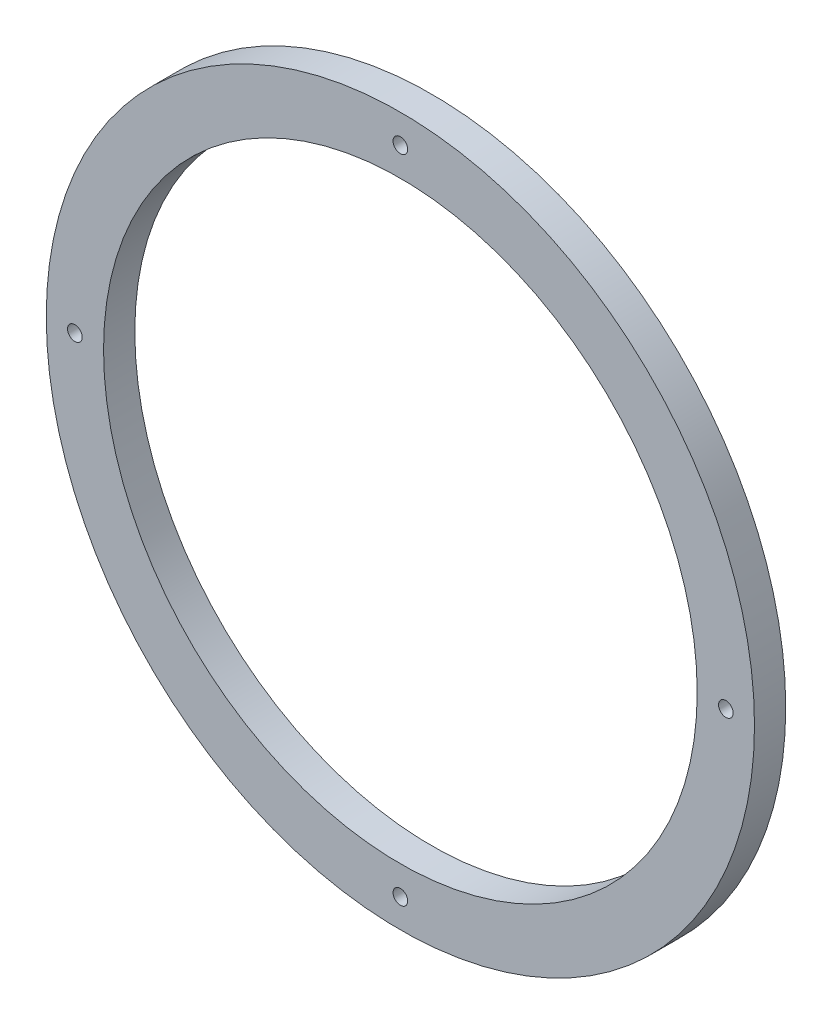
ISO-10303-21;
HEADER;
FILE_DESCRIPTION(('STEP AP214'),'2;1');
FILE_NAME('part.step','',(''),(''),'','','');
FILE_SCHEMA(('AUTOMOTIVE_DESIGN { 1 0 10303 214 1 1 1 1 }'));
ENDSEC;
DATA;
#1=APPLICATION_CONTEXT('core data for automotive mechanical design processes');
#2=APPLICATION_PROTOCOL_DEFINITION('international standard','automotive_design',2000,#1);
#3=PRODUCT_CONTEXT('',#1,'mechanical');
#4=PRODUCT('Part','Part','',(#3));
#5=PRODUCT_RELATED_PRODUCT_CATEGORY('part','',(#4));
#6=PRODUCT_DEFINITION_FORMATION('','',#4);
#7=PRODUCT_DEFINITION_CONTEXT('part definition',#1,'design');
#8=PRODUCT_DEFINITION('design','',#6,#7);
#9=PRODUCT_DEFINITION_SHAPE('','',#8);
#10=(LENGTH_UNIT() NAMED_UNIT(*) SI_UNIT(.MILLI.,.METRE.));
#11=(NAMED_UNIT(*) PLANE_ANGLE_UNIT() SI_UNIT($,.RADIAN.));
#12=(NAMED_UNIT(*) SI_UNIT($,.STERADIAN.) SOLID_ANGLE_UNIT());
#13=UNCERTAINTY_MEASURE_WITH_UNIT(LENGTH_MEASURE(1.E-05),#10,'distance_accuracy_value','');
#14=(GEOMETRIC_REPRESENTATION_CONTEXT(3) GLOBAL_UNCERTAINTY_ASSIGNED_CONTEXT((#13)) GLOBAL_UNIT_ASSIGNED_CONTEXT((#10,
#11,#12)) REPRESENTATION_CONTEXT('',''));
#15=CARTESIAN_POINT('',(0.,0.,0.));
#16=DIRECTION('',(0.,0.,1.));
#17=DIRECTION('',(1.,0.,0.));
#18=AXIS2_PLACEMENT_3D('',#15,#16,#17);
#19=CARTESIAN_POINT('',(0.,0.,7.62));
#20=DIRECTION('',(0.,0.,1.));
#21=DIRECTION('',(1.,0.,0.));
#22=AXIS2_PLACEMENT_3D('',#19,#20,#21);
#23=PLANE('',#22);
#24=CARTESIAN_POINT('',(2.28331861052244E-12,-79.3749999999977,7.62));
#25=DIRECTION('',(0.,0.,1.));
#26=DIRECTION('',(1.,0.,0.));
#27=AXIS2_PLACEMENT_3D('',#24,#25,#26);
#28=CIRCLE('',#27,1.78593750000338);
#29=CARTESIAN_POINT('',(-1.7859375000011,-79.3749999999977,7.62));
#30=VERTEX_POINT('',#29);
#31=EDGE_CURVE('E60',#30,#30,#28,.T.);
#32=ORIENTED_EDGE('',*,*,#31,.F.);
#33=EDGE_LOOP('',(#32));
#34=FACE_BOUND('',#33,.T.);
#35=CARTESIAN_POINT('',(0.,79.375,7.62));
#36=DIRECTION('',(0.,0.,1.));
#37=DIRECTION('',(1.,0.,0.));
#38=AXIS2_PLACEMENT_3D('',#35,#36,#37);
#39=CIRCLE('',#38,1.7859375);
#40=CARTESIAN_POINT('',(-1.7859375,79.375,7.62));
#41=VERTEX_POINT('',#40);
#42=EDGE_CURVE('E48',#41,#41,#39,.T.);
#43=ORIENTED_EDGE('',*,*,#42,.F.);
#44=EDGE_LOOP('',(#43));
#45=FACE_BOUND('',#44,.T.);
#46=CARTESIAN_POINT('',(0.,0.,7.62));
#47=DIRECTION('',(0.,0.,1.));
#48=DIRECTION('',(1.,0.,0.));
#49=AXIS2_PLACEMENT_3D('',#46,#47,#48);
#50=CIRCLE('',#49,86.36);
#51=CARTESIAN_POINT('',(-86.36,0.,7.62));
#52=VERTEX_POINT('',#51);
#53=EDGE_CURVE('E10',#52,#52,#50,.T.);
#54=ORIENTED_EDGE('',*,*,#53,.T.);
#55=EDGE_LOOP('',(#54));
#56=FACE_BOUND('',#55,.T.);
#57=CARTESIAN_POINT('',(0.,0.,7.62));
#58=DIRECTION('',(0.,0.,1.));
#59=DIRECTION('',(1.,0.,0.));
#60=AXIS2_PLACEMENT_3D('',#57,#58,#59);
#61=CIRCLE('',#60,72.39);
#62=CARTESIAN_POINT('',(-72.39,0.,7.62));
#63=VERTEX_POINT('',#62);
#64=EDGE_CURVE('E43',#63,#63,#61,.T.);
#65=ORIENTED_EDGE('',*,*,#64,.F.);
#66=EDGE_LOOP('',(#65));
#67=FACE_BOUND('',#66,.T.);
#68=CARTESIAN_POINT('',(79.375,2.27595720048157E-12,7.62));
#69=DIRECTION('',(0.,0.,1.));
#70=DIRECTION('',(1.,0.,0.));
#71=AXIS2_PLACEMENT_3D('',#68,#69,#70);
#72=CIRCLE('',#71,1.78593750000244);
#73=CARTESIAN_POINT('',(77.5890624999976,2.27595720048157E-12,7.62));
#74=VERTEX_POINT('',#73);
#75=EDGE_CURVE('E54',#74,#74,#72,.T.);
#76=ORIENTED_EDGE('',*,*,#75,.F.);
#77=EDGE_LOOP('',(#76));
#78=FACE_BOUND('',#77,.T.);
#79=CARTESIAN_POINT('',(-79.3749999999978,0.,7.62));
#80=DIRECTION('',(0.,0.,1.));
#81=DIRECTION('',(1.,0.,0.));
#82=AXIS2_PLACEMENT_3D('',#79,#80,#81);
#83=CIRCLE('',#82,1.78593750000146);
#84=CARTESIAN_POINT('',(-81.1609374999992,0.,7.62));
#85=VERTEX_POINT('',#84);
#86=EDGE_CURVE('E66',#85,#85,#83,.T.);
#87=ORIENTED_EDGE('',*,*,#86,.F.);
#88=EDGE_LOOP('',(#87));
#89=FACE_BOUND('',#88,.T.);
#90=ADVANCED_FACE('F32',(#34,#45,#56,#67,#78,#89),#23,.T.);
#91=CARTESIAN_POINT('',(0.,0.,0.));
#92=DIRECTION('',(0.,0.,1.));
#93=DIRECTION('',(1.,0.,0.));
#94=AXIS2_PLACEMENT_3D('',#91,#92,#93);
#95=PLANE('',#94);
#96=CARTESIAN_POINT('',(0.,0.,0.));
#97=DIRECTION('',(0.,0.,1.));
#98=DIRECTION('',(1.,0.,0.));
#99=AXIS2_PLACEMENT_3D('',#96,#97,#98);
#100=CIRCLE('',#99,86.36);
#101=CARTESIAN_POINT('',(-86.36,0.,0.));
#102=VERTEX_POINT('',#101);
#103=EDGE_CURVE('E36',#102,#102,#100,.T.);
#104=ORIENTED_EDGE('',*,*,#103,.F.);
#105=EDGE_LOOP('',(#104));
#106=FACE_BOUND('',#105,.T.);
#107=CARTESIAN_POINT('',(0.,0.,0.));
#108=DIRECTION('',(0.,0.,1.));
#109=DIRECTION('',(1.,0.,0.));
#110=AXIS2_PLACEMENT_3D('',#107,#108,#109);
#111=CIRCLE('',#110,72.39);
#112=CARTESIAN_POINT('',(-72.39,0.,0.));
#113=VERTEX_POINT('',#112);
#114=EDGE_CURVE('E45',#113,#113,#111,.T.);
#115=ORIENTED_EDGE('',*,*,#114,.T.);
#116=EDGE_LOOP('',(#115));
#117=FACE_BOUND('',#116,.T.);
#118=CARTESIAN_POINT('',(0.,79.375,0.));
#119=DIRECTION('',(0.,0.,1.));
#120=DIRECTION('',(1.,0.,0.));
#121=AXIS2_PLACEMENT_3D('',#118,#119,#120);
#122=CIRCLE('',#121,1.7859375);
#123=CARTESIAN_POINT('',(-1.7859375,79.375,0.));
#124=VERTEX_POINT('',#123);
#125=EDGE_CURVE('E51',#124,#124,#122,.T.);
#126=ORIENTED_EDGE('',*,*,#125,.T.);
#127=EDGE_LOOP('',(#126));
#128=FACE_BOUND('',#127,.T.);
#129=CARTESIAN_POINT('',(79.375,2.27595720048157E-12,0.));
#130=DIRECTION('',(0.,0.,1.));
#131=DIRECTION('',(1.,0.,0.));
#132=AXIS2_PLACEMENT_3D('',#129,#130,#131);
#133=CIRCLE('',#132,1.78593750000244);
#134=CARTESIAN_POINT('',(77.5890624999976,2.27595720048157E-12,0.));
#135=VERTEX_POINT('',#134);
#136=EDGE_CURVE('E57',#135,#135,#133,.T.);
#137=ORIENTED_EDGE('',*,*,#136,.T.);
#138=EDGE_LOOP('',(#137));
#139=FACE_BOUND('',#138,.T.);
#140=CARTESIAN_POINT('',(2.28331861052244E-12,-79.3749999999977,0.));
#141=DIRECTION('',(0.,0.,1.));
#142=DIRECTION('',(1.,0.,0.));
#143=AXIS2_PLACEMENT_3D('',#140,#141,#142);
#144=CIRCLE('',#143,1.78593750000338);
#145=CARTESIAN_POINT('',(-1.7859375000011,-79.3749999999977,0.));
#146=VERTEX_POINT('',#145);
#147=EDGE_CURVE('E63',#146,#146,#144,.T.);
#148=ORIENTED_EDGE('',*,*,#147,.T.);
#149=EDGE_LOOP('',(#148));
#150=FACE_BOUND('',#149,.T.);
#151=CARTESIAN_POINT('',(-79.3749999999978,0.,0.));
#152=DIRECTION('',(0.,0.,1.));
#153=DIRECTION('',(1.,0.,0.));
#154=AXIS2_PLACEMENT_3D('',#151,#152,#153);
#155=CIRCLE('',#154,1.78593750000146);
#156=CARTESIAN_POINT('',(-81.1609374999992,0.,0.));
#157=VERTEX_POINT('',#156);
#158=EDGE_CURVE('E69',#157,#157,#155,.T.);
#159=ORIENTED_EDGE('',*,*,#158,.T.);
#160=EDGE_LOOP('',(#159));
#161=FACE_BOUND('',#160,.T.);
#162=ADVANCED_FACE('F79',(#106,#117,#128,#139,#150,#161),#95,.F.);
#163=CARTESIAN_POINT('',(0.,0.,7.62));
#164=DIRECTION('',(0.,0.,-1.));
#165=DIRECTION('',(-1.,0.,0.));
#166=AXIS2_PLACEMENT_3D('',#163,#164,#165);
#167=CYLINDRICAL_SURFACE('',#166,86.36);
#168=CARTESIAN_POINT('',(-86.36,0.,7.62));
#169=CARTESIAN_POINT('',(-86.36,0.,7.540625));
#170=CARTESIAN_POINT('',(-86.36,0.,7.46125));
#171=CARTESIAN_POINT('',(-86.36,0.,7.3025));
#172=CARTESIAN_POINT('',(-86.36,0.,7.223125));
#173=CARTESIAN_POINT('',(-86.36,0.,7.064375));
#174=CARTESIAN_POINT('',(-86.36,0.,6.985));
#175=CARTESIAN_POINT('',(-86.36,0.,6.82625));
#176=CARTESIAN_POINT('',(-86.36,0.,6.746875));
#177=CARTESIAN_POINT('',(-86.36,0.,6.588125));
#178=CARTESIAN_POINT('',(-86.36,0.,6.50875));
#179=CARTESIAN_POINT('',(-86.36,0.,6.35));
#180=CARTESIAN_POINT('',(-86.36,0.,6.270625));
#181=CARTESIAN_POINT('',(-86.36,0.,6.111875));
#182=CARTESIAN_POINT('',(-86.36,0.,6.0325));
#183=CARTESIAN_POINT('',(-86.36,0.,5.87375));
#184=CARTESIAN_POINT('',(-86.36,0.,5.794375));
#185=CARTESIAN_POINT('',(-86.36,0.,5.635625));
#186=CARTESIAN_POINT('',(-86.36,0.,5.55625));
#187=CARTESIAN_POINT('',(-86.36,0.,5.3975));
#188=CARTESIAN_POINT('',(-86.36,0.,5.318125));
#189=CARTESIAN_POINT('',(-86.36,0.,5.159375));
#190=CARTESIAN_POINT('',(-86.36,0.,5.08));
#191=CARTESIAN_POINT('',(-86.36,0.,4.92125));
#192=CARTESIAN_POINT('',(-86.36,0.,4.841875));
#193=CARTESIAN_POINT('',(-86.36,0.,4.683125));
#194=CARTESIAN_POINT('',(-86.36,0.,4.60375));
#195=CARTESIAN_POINT('',(-86.36,0.,4.445));
#196=CARTESIAN_POINT('',(-86.36,0.,4.365625));
#197=CARTESIAN_POINT('',(-86.36,0.,4.206875));
#198=CARTESIAN_POINT('',(-86.36,0.,4.1275));
#199=CARTESIAN_POINT('',(-86.36,0.,3.96875));
#200=CARTESIAN_POINT('',(-86.36,0.,3.889375));
#201=CARTESIAN_POINT('',(-86.36,0.,3.730625));
#202=CARTESIAN_POINT('',(-86.36,0.,3.65125));
#203=CARTESIAN_POINT('',(-86.36,0.,3.4925));
#204=CARTESIAN_POINT('',(-86.36,0.,3.413125));
#205=CARTESIAN_POINT('',(-86.36,0.,3.254375));
#206=CARTESIAN_POINT('',(-86.36,0.,3.175));
#207=CARTESIAN_POINT('',(-86.36,0.,3.01625));
#208=CARTESIAN_POINT('',(-86.36,0.,2.936875));
#209=CARTESIAN_POINT('',(-86.36,0.,2.778125));
#210=CARTESIAN_POINT('',(-86.36,0.,2.69875));
#211=CARTESIAN_POINT('',(-86.36,0.,2.54));
#212=CARTESIAN_POINT('',(-86.36,0.,2.460625));
#213=CARTESIAN_POINT('',(-86.36,0.,2.301875));
#214=CARTESIAN_POINT('',(-86.36,0.,2.2225));
#215=CARTESIAN_POINT('',(-86.36,0.,2.06375));
#216=CARTESIAN_POINT('',(-86.36,0.,1.984375));
#217=CARTESIAN_POINT('',(-86.36,0.,1.825625));
#218=CARTESIAN_POINT('',(-86.36,0.,1.74625));
#219=CARTESIAN_POINT('',(-86.36,0.,1.5875));
#220=CARTESIAN_POINT('',(-86.36,0.,1.508125));
#221=CARTESIAN_POINT('',(-86.36,0.,1.349375));
#222=CARTESIAN_POINT('',(-86.36,0.,1.27));
#223=CARTESIAN_POINT('',(-86.36,0.,1.11125));
#224=CARTESIAN_POINT('',(-86.36,0.,1.031875));
#225=CARTESIAN_POINT('',(-86.36,0.,0.873125));
#226=CARTESIAN_POINT('',(-86.36,0.,0.79375));
#227=CARTESIAN_POINT('',(-86.36,0.,0.635));
#228=CARTESIAN_POINT('',(-86.36,0.,0.555625));
#229=CARTESIAN_POINT('',(-86.36,0.,0.396875));
#230=CARTESIAN_POINT('',(-86.36,0.,0.3175));
#231=CARTESIAN_POINT('',(-86.36,0.,0.15875));
#232=CARTESIAN_POINT('',(-86.36,0.,0.0793749999999999));
#233=CARTESIAN_POINT('',(-86.36,0.,0.));
#234=B_SPLINE_CURVE_WITH_KNOTS('',3,(#168,#169,#170,#171,#172,#173,#174,#175,#176,#177,#178,
#179,#180,#181,#182,#183,#184,#185,#186,#187,#188,#189,#190,#191,#192,#193,#194,#195,#196,#197,
#198,#199,#200,#201,#202,#203,#204,#205,#206,#207,#208,#209,#210,#211,#212,#213,#214,#215,#216,
#217,#218,#219,#220,#221,#222,#223,#224,#225,#226,#227,#228,#229,#230,#231,#232,#233),
.UNSPECIFIED.,.F.,.F.,(4,2,2,2,2,2,2,2,2,2,2,2,2,2,2,2,2,2,2,2,2,2,2,2,2,2,2,2,2,2,2,2,4),(0.,
0.238125,0.476249999999999,0.714375,0.952499999999999,1.190625,1.42875,1.666875,1.905,2.143125,
2.38125,2.619375,2.8575,3.095625,3.33375,3.571875,3.81,4.048125,4.28625,4.524375,4.7625,
5.000625,5.23875,5.476875,5.715,5.953125,6.19125,6.429375,6.6675,6.905625,7.14375,7.381875,
7.62),.UNSPECIFIED.);
#235=EDGE_CURVE('BSEAM34',#52,#102,#234,.T.);
#236=ORIENTED_EDGE('',*,*,#53,.F.);
#237=ORIENTED_EDGE('',*,*,#103,.T.);
#238=ORIENTED_EDGE('',*,*,#235,.T.);
#239=ORIENTED_EDGE('',*,*,#235,.F.);
#240=EDGE_LOOP('',(#236,#238,#237,#239));
#241=FACE_BOUND('',#240,.T.);
#242=ADVANCED_FACE('F34',(#241),#167,.T.);
#243=CARTESIAN_POINT('',(0.,0.,7.62));
#244=DIRECTION('',(0.,0.,-1.));
#245=DIRECTION('',(-1.,0.,0.));
#246=AXIS2_PLACEMENT_3D('',#243,#244,#245);
#247=CYLINDRICAL_SURFACE('',#246,72.39);
#248=CARTESIAN_POINT('',(-72.39,0.,7.62));
#249=CARTESIAN_POINT('',(-72.39,0.,7.540625));
#250=CARTESIAN_POINT('',(-72.39,0.,7.46125));
#251=CARTESIAN_POINT('',(-72.39,0.,7.3025));
#252=CARTESIAN_POINT('',(-72.39,0.,7.223125));
#253=CARTESIAN_POINT('',(-72.39,0.,7.064375));
#254=CARTESIAN_POINT('',(-72.39,0.,6.985));
#255=CARTESIAN_POINT('',(-72.39,0.,6.82625));
#256=CARTESIAN_POINT('',(-72.39,0.,6.746875));
#257=CARTESIAN_POINT('',(-72.39,0.,6.588125));
#258=CARTESIAN_POINT('',(-72.39,0.,6.50875));
#259=CARTESIAN_POINT('',(-72.39,0.,6.35));
#260=CARTESIAN_POINT('',(-72.39,0.,6.270625));
#261=CARTESIAN_POINT('',(-72.39,0.,6.111875));
#262=CARTESIAN_POINT('',(-72.39,0.,6.0325));
#263=CARTESIAN_POINT('',(-72.39,0.,5.87375));
#264=CARTESIAN_POINT('',(-72.39,0.,5.794375));
#265=CARTESIAN_POINT('',(-72.39,0.,5.635625));
#266=CARTESIAN_POINT('',(-72.39,0.,5.55625));
#267=CARTESIAN_POINT('',(-72.39,0.,5.3975));
#268=CARTESIAN_POINT('',(-72.39,0.,5.318125));
#269=CARTESIAN_POINT('',(-72.39,0.,5.159375));
#270=CARTESIAN_POINT('',(-72.39,0.,5.08));
#271=CARTESIAN_POINT('',(-72.39,0.,4.92125));
#272=CARTESIAN_POINT('',(-72.39,0.,4.841875));
#273=CARTESIAN_POINT('',(-72.39,0.,4.683125));
#274=CARTESIAN_POINT('',(-72.39,0.,4.60375));
#275=CARTESIAN_POINT('',(-72.39,0.,4.445));
#276=CARTESIAN_POINT('',(-72.39,0.,4.365625));
#277=CARTESIAN_POINT('',(-72.39,0.,4.206875));
#278=CARTESIAN_POINT('',(-72.39,0.,4.1275));
#279=CARTESIAN_POINT('',(-72.39,0.,3.96875));
#280=CARTESIAN_POINT('',(-72.39,0.,3.889375));
#281=CARTESIAN_POINT('',(-72.39,0.,3.730625));
#282=CARTESIAN_POINT('',(-72.39,0.,3.65125));
#283=CARTESIAN_POINT('',(-72.39,0.,3.4925));
#284=CARTESIAN_POINT('',(-72.39,0.,3.413125));
#285=CARTESIAN_POINT('',(-72.39,0.,3.254375));
#286=CARTESIAN_POINT('',(-72.39,0.,3.175));
#287=CARTESIAN_POINT('',(-72.39,0.,3.01625));
#288=CARTESIAN_POINT('',(-72.39,0.,2.936875));
#289=CARTESIAN_POINT('',(-72.39,0.,2.778125));
#290=CARTESIAN_POINT('',(-72.39,0.,2.69875));
#291=CARTESIAN_POINT('',(-72.39,0.,2.54));
#292=CARTESIAN_POINT('',(-72.39,0.,2.460625));
#293=CARTESIAN_POINT('',(-72.39,0.,2.301875));
#294=CARTESIAN_POINT('',(-72.39,0.,2.2225));
#295=CARTESIAN_POINT('',(-72.39,0.,2.06375));
#296=CARTESIAN_POINT('',(-72.39,0.,1.984375));
#297=CARTESIAN_POINT('',(-72.39,0.,1.825625));
#298=CARTESIAN_POINT('',(-72.39,0.,1.74625));
#299=CARTESIAN_POINT('',(-72.39,0.,1.5875));
#300=CARTESIAN_POINT('',(-72.39,0.,1.508125));
#301=CARTESIAN_POINT('',(-72.39,0.,1.349375));
#302=CARTESIAN_POINT('',(-72.39,0.,1.27));
#303=CARTESIAN_POINT('',(-72.39,0.,1.11125));
#304=CARTESIAN_POINT('',(-72.39,0.,1.031875));
#305=CARTESIAN_POINT('',(-72.39,0.,0.873125));
#306=CARTESIAN_POINT('',(-72.39,0.,0.79375));
#307=CARTESIAN_POINT('',(-72.39,0.,0.635));
#308=CARTESIAN_POINT('',(-72.39,0.,0.555625));
#309=CARTESIAN_POINT('',(-72.39,0.,0.396875));
#310=CARTESIAN_POINT('',(-72.39,0.,0.3175));
#311=CARTESIAN_POINT('',(-72.39,0.,0.15875));
#312=CARTESIAN_POINT('',(-72.39,0.,0.0793749999999999));
#313=CARTESIAN_POINT('',(-72.39,0.,0.));
#314=B_SPLINE_CURVE_WITH_KNOTS('',3,(#248,#249,#250,#251,#252,#253,#254,#255,#256,#257,#258,
#259,#260,#261,#262,#263,#264,#265,#266,#267,#268,#269,#270,#271,#272,#273,#274,#275,#276,#277,
#278,#279,#280,#281,#282,#283,#284,#285,#286,#287,#288,#289,#290,#291,#292,#293,#294,#295,#296,
#297,#298,#299,#300,#301,#302,#303,#304,#305,#306,#307,#308,#309,#310,#311,#312,#313),
.UNSPECIFIED.,.F.,.F.,(4,2,2,2,2,2,2,2,2,2,2,2,2,2,2,2,2,2,2,2,2,2,2,2,2,2,2,2,2,2,2,2,4),(0.,
0.238125,0.476249999999999,0.714375,0.952499999999999,1.190625,1.42875,1.666875,1.905,2.143125,
2.38125,2.619375,2.8575,3.095625,3.33375,3.571875,3.81,4.048125,4.28625,4.524375,4.7625,
5.000625,5.23875,5.476875,5.715,5.953125,6.19125,6.429375,6.6675,6.905625,7.14375,7.381875,
7.62),.UNSPECIFIED.);
#315=EDGE_CURVE('BSEAM89',#63,#113,#314,.T.);
#316=ORIENTED_EDGE('',*,*,#64,.T.);
#317=ORIENTED_EDGE('',*,*,#114,.F.);
#318=ORIENTED_EDGE('',*,*,#315,.T.);
#319=ORIENTED_EDGE('',*,*,#315,.F.);
#320=EDGE_LOOP('',(#316,#318,#317,#319));
#321=FACE_BOUND('',#320,.T.);
#322=ADVANCED_FACE('F89',(#321),#247,.F.);
#323=CARTESIAN_POINT('',(0.,79.375,7.62));
#324=DIRECTION('',(0.,0.,-1.));
#325=DIRECTION('',(-1.,0.,0.));
#326=AXIS2_PLACEMENT_3D('',#323,#324,#325);
#327=CYLINDRICAL_SURFACE('',#326,1.7859375);
#328=CARTESIAN_POINT('',(-1.7859375,79.375,7.62));
#329=CARTESIAN_POINT('',(-1.7859375,79.375,7.540625));
#330=CARTESIAN_POINT('',(-1.7859375,79.375,7.46125));
#331=CARTESIAN_POINT('',(-1.7859375,79.375,7.3025));
#332=CARTESIAN_POINT('',(-1.7859375,79.375,7.223125));
#333=CARTESIAN_POINT('',(-1.7859375,79.375,7.064375));
#334=CARTESIAN_POINT('',(-1.7859375,79.375,6.985));
#335=CARTESIAN_POINT('',(-1.7859375,79.375,6.82625));
#336=CARTESIAN_POINT('',(-1.7859375,79.375,6.746875));
#337=CARTESIAN_POINT('',(-1.7859375,79.375,6.588125));
#338=CARTESIAN_POINT('',(-1.7859375,79.375,6.50875));
#339=CARTESIAN_POINT('',(-1.7859375,79.375,6.35));
#340=CARTESIAN_POINT('',(-1.7859375,79.375,6.270625));
#341=CARTESIAN_POINT('',(-1.7859375,79.375,6.111875));
#342=CARTESIAN_POINT('',(-1.7859375,79.375,6.0325));
#343=CARTESIAN_POINT('',(-1.7859375,79.375,5.87375));
#344=CARTESIAN_POINT('',(-1.7859375,79.375,5.794375));
#345=CARTESIAN_POINT('',(-1.7859375,79.375,5.635625));
#346=CARTESIAN_POINT('',(-1.7859375,79.375,5.55625));
#347=CARTESIAN_POINT('',(-1.7859375,79.375,5.3975));
#348=CARTESIAN_POINT('',(-1.7859375,79.375,5.318125));
#349=CARTESIAN_POINT('',(-1.7859375,79.375,5.159375));
#350=CARTESIAN_POINT('',(-1.7859375,79.375,5.08));
#351=CARTESIAN_POINT('',(-1.7859375,79.375,4.92125));
#352=CARTESIAN_POINT('',(-1.7859375,79.375,4.841875));
#353=CARTESIAN_POINT('',(-1.7859375,79.375,4.683125));
#354=CARTESIAN_POINT('',(-1.7859375,79.375,4.60375));
#355=CARTESIAN_POINT('',(-1.7859375,79.375,4.445));
#356=CARTESIAN_POINT('',(-1.7859375,79.375,4.365625));
#357=CARTESIAN_POINT('',(-1.7859375,79.375,4.206875));
#358=CARTESIAN_POINT('',(-1.7859375,79.375,4.1275));
#359=CARTESIAN_POINT('',(-1.7859375,79.375,3.96875));
#360=CARTESIAN_POINT('',(-1.7859375,79.375,3.889375));
#361=CARTESIAN_POINT('',(-1.7859375,79.375,3.730625));
#362=CARTESIAN_POINT('',(-1.7859375,79.375,3.65125));
#363=CARTESIAN_POINT('',(-1.7859375,79.375,3.4925));
#364=CARTESIAN_POINT('',(-1.7859375,79.375,3.413125));
#365=CARTESIAN_POINT('',(-1.7859375,79.375,3.254375));
#366=CARTESIAN_POINT('',(-1.7859375,79.375,3.175));
#367=CARTESIAN_POINT('',(-1.7859375,79.375,3.01625));
#368=CARTESIAN_POINT('',(-1.7859375,79.375,2.936875));
#369=CARTESIAN_POINT('',(-1.7859375,79.375,2.778125));
#370=CARTESIAN_POINT('',(-1.7859375,79.375,2.69875));
#371=CARTESIAN_POINT('',(-1.7859375,79.375,2.54));
#372=CARTESIAN_POINT('',(-1.7859375,79.375,2.460625));
#373=CARTESIAN_POINT('',(-1.7859375,79.375,2.301875));
#374=CARTESIAN_POINT('',(-1.7859375,79.375,2.2225));
#375=CARTESIAN_POINT('',(-1.7859375,79.375,2.06375));
#376=CARTESIAN_POINT('',(-1.7859375,79.375,1.984375));
#377=CARTESIAN_POINT('',(-1.7859375,79.375,1.825625));
#378=CARTESIAN_POINT('',(-1.7859375,79.375,1.74625));
#379=CARTESIAN_POINT('',(-1.7859375,79.375,1.5875));
#380=CARTESIAN_POINT('',(-1.7859375,79.375,1.508125));
#381=CARTESIAN_POINT('',(-1.7859375,79.375,1.349375));
#382=CARTESIAN_POINT('',(-1.7859375,79.375,1.27));
#383=CARTESIAN_POINT('',(-1.7859375,79.375,1.11125));
#384=CARTESIAN_POINT('',(-1.7859375,79.375,1.031875));
#385=CARTESIAN_POINT('',(-1.7859375,79.375,0.873125));
#386=CARTESIAN_POINT('',(-1.7859375,79.375,0.79375));
#387=CARTESIAN_POINT('',(-1.7859375,79.375,0.635));
#388=CARTESIAN_POINT('',(-1.7859375,79.375,0.555625));
#389=CARTESIAN_POINT('',(-1.7859375,79.375,0.396875));
#390=CARTESIAN_POINT('',(-1.7859375,79.375,0.3175));
#391=CARTESIAN_POINT('',(-1.7859375,79.375,0.15875));
#392=CARTESIAN_POINT('',(-1.7859375,79.375,0.0793749999999999));
#393=CARTESIAN_POINT('',(-1.7859375,79.375,0.));
#394=B_SPLINE_CURVE_WITH_KNOTS('',3,(#328,#329,#330,#331,#332,#333,#334,#335,#336,#337,#338,
#339,#340,#341,#342,#343,#344,#345,#346,#347,#348,#349,#350,#351,#352,#353,#354,#355,#356,#357,
#358,#359,#360,#361,#362,#363,#364,#365,#366,#367,#368,#369,#370,#371,#372,#373,#374,#375,#376,
#377,#378,#379,#380,#381,#382,#383,#384,#385,#386,#387,#388,#389,#390,#391,#392,#393),
.UNSPECIFIED.,.F.,.F.,(4,2,2,2,2,2,2,2,2,2,2,2,2,2,2,2,2,2,2,2,2,2,2,2,2,2,2,2,2,2,2,2,4),(0.,
0.238125,0.47625,0.714375000000001,0.9525,1.190625,1.42875,1.666875,1.905,2.143125,2.38125,
2.619375,2.8575,3.095625,3.33375,3.571875,3.81,4.048125,4.28625,4.524375,4.7625,5.000625,
5.23875,5.476875,5.715,5.953125,6.19125,6.429375,6.6675,6.905625,7.14375,7.381875,7.62),.UNSPECIFIED.);
#395=EDGE_CURVE('BSEAM92',#41,#124,#394,.T.);
#396=ORIENTED_EDGE('',*,*,#42,.T.);
#397=ORIENTED_EDGE('',*,*,#125,.F.);
#398=ORIENTED_EDGE('',*,*,#395,.T.);
#399=ORIENTED_EDGE('',*,*,#395,.F.);
#400=EDGE_LOOP('',(#396,#398,#397,#399));
#401=FACE_BOUND('',#400,.T.);
#402=ADVANCED_FACE('F92',(#401),#327,.F.);
#403=CARTESIAN_POINT('',(79.375,2.27595720048157E-12,7.62));
#404=DIRECTION('',(0.,0.,-1.));
#405=DIRECTION('',(-1.,0.,0.));
#406=AXIS2_PLACEMENT_3D('',#403,#404,#405);
#407=CYLINDRICAL_SURFACE('',#406,1.78593750000244);
#408=CARTESIAN_POINT('',(77.5890624999976,2.27595720048157E-12,7.62));
#409=CARTESIAN_POINT('',(77.5890624999976,2.27595720048157E-12,7.540625));
#410=CARTESIAN_POINT('',(77.5890624999976,2.27595720048157E-12,7.46125));
#411=CARTESIAN_POINT('',(77.5890624999976,2.27595720048157E-12,7.3025));
#412=CARTESIAN_POINT('',(77.5890624999976,2.27595720048157E-12,7.223125));
#413=CARTESIAN_POINT('',(77.5890624999976,2.27595720048157E-12,7.064375));
#414=CARTESIAN_POINT('',(77.5890624999976,2.27595720048157E-12,6.985));
#415=CARTESIAN_POINT('',(77.5890624999976,2.27595720048157E-12,6.82625));
#416=CARTESIAN_POINT('',(77.5890624999976,2.27595720048157E-12,6.746875));
#417=CARTESIAN_POINT('',(77.5890624999976,2.27595720048157E-12,6.588125));
#418=CARTESIAN_POINT('',(77.5890624999976,2.27595720048157E-12,6.50875));
#419=CARTESIAN_POINT('',(77.5890624999976,2.27595720048157E-12,6.35));
#420=CARTESIAN_POINT('',(77.5890624999976,2.27595720048157E-12,6.270625));
#421=CARTESIAN_POINT('',(77.5890624999976,2.27595720048157E-12,6.111875));
#422=CARTESIAN_POINT('',(77.5890624999976,2.27595720048157E-12,6.0325));
#423=CARTESIAN_POINT('',(77.5890624999976,2.27595720048157E-12,5.87375));
#424=CARTESIAN_POINT('',(77.5890624999976,2.27595720048157E-12,5.794375));
#425=CARTESIAN_POINT('',(77.5890624999976,2.27595720048157E-12,5.635625));
#426=CARTESIAN_POINT('',(77.5890624999976,2.27595720048157E-12,5.55625));
#427=CARTESIAN_POINT('',(77.5890624999976,2.27595720048157E-12,5.3975));
#428=CARTESIAN_POINT('',(77.5890624999976,2.27595720048157E-12,5.318125));
#429=CARTESIAN_POINT('',(77.5890624999976,2.27595720048157E-12,5.159375));
#430=CARTESIAN_POINT('',(77.5890624999976,2.27595720048157E-12,5.08));
#431=CARTESIAN_POINT('',(77.5890624999976,2.27595720048157E-12,4.92125));
#432=CARTESIAN_POINT('',(77.5890624999976,2.27595720048157E-12,4.841875));
#433=CARTESIAN_POINT('',(77.5890624999976,2.27595720048157E-12,4.683125));
#434=CARTESIAN_POINT('',(77.5890624999976,2.27595720048157E-12,4.60375));
#435=CARTESIAN_POINT('',(77.5890624999976,2.27595720048157E-12,4.445));
#436=CARTESIAN_POINT('',(77.5890624999976,2.27595720048157E-12,4.365625));
#437=CARTESIAN_POINT('',(77.5890624999976,2.27595720048157E-12,4.206875));
#438=CARTESIAN_POINT('',(77.5890624999976,2.27595720048157E-12,4.1275));
#439=CARTESIAN_POINT('',(77.5890624999976,2.27595720048157E-12,3.96875));
#440=CARTESIAN_POINT('',(77.5890624999976,2.27595720048157E-12,3.889375));
#441=CARTESIAN_POINT('',(77.5890624999976,2.27595720048157E-12,3.730625));
#442=CARTESIAN_POINT('',(77.5890624999976,2.27595720048157E-12,3.65125));
#443=CARTESIAN_POINT('',(77.5890624999976,2.27595720048157E-12,3.4925));
#444=CARTESIAN_POINT('',(77.5890624999976,2.27595720048157E-12,3.413125));
#445=CARTESIAN_POINT('',(77.5890624999976,2.27595720048157E-12,3.254375));
#446=CARTESIAN_POINT('',(77.5890624999976,2.27595720048157E-12,3.175));
#447=CARTESIAN_POINT('',(77.5890624999976,2.27595720048157E-12,3.01625));
#448=CARTESIAN_POINT('',(77.5890624999976,2.27595720048157E-12,2.936875));
#449=CARTESIAN_POINT('',(77.5890624999976,2.27595720048157E-12,2.778125));
#450=CARTESIAN_POINT('',(77.5890624999976,2.27595720048157E-12,2.69875));
#451=CARTESIAN_POINT('',(77.5890624999976,2.27595720048157E-12,2.54));
#452=CARTESIAN_POINT('',(77.5890624999976,2.27595720048157E-12,2.460625));
#453=CARTESIAN_POINT('',(77.5890624999976,2.27595720048157E-12,2.301875));
#454=CARTESIAN_POINT('',(77.5890624999976,2.27595720048157E-12,2.2225));
#455=CARTESIAN_POINT('',(77.5890624999976,2.27595720048157E-12,2.06375));
#456=CARTESIAN_POINT('',(77.5890624999976,2.27595720048157E-12,1.984375));
#457=CARTESIAN_POINT('',(77.5890624999976,2.27595720048157E-12,1.825625));
#458=CARTESIAN_POINT('',(77.5890624999976,2.27595720048157E-12,1.74625));
#459=CARTESIAN_POINT('',(77.5890624999976,2.27595720048157E-12,1.5875));
#460=CARTESIAN_POINT('',(77.5890624999976,2.27595720048157E-12,1.508125));
#461=CARTESIAN_POINT('',(77.5890624999976,2.27595720048157E-12,1.349375));
#462=CARTESIAN_POINT('',(77.5890624999976,2.27595720048157E-12,1.27));
#463=CARTESIAN_POINT('',(77.5890624999976,2.27595720048157E-12,1.11125));
#464=CARTESIAN_POINT('',(77.5890624999976,2.27595720048157E-12,1.031875));
#465=CARTESIAN_POINT('',(77.5890624999976,2.27595720048157E-12,0.873125));
#466=CARTESIAN_POINT('',(77.5890624999976,2.27595720048157E-12,0.79375));
#467=CARTESIAN_POINT('',(77.5890624999976,2.27595720048157E-12,0.635));
#468=CARTESIAN_POINT('',(77.5890624999976,2.27595720048157E-12,0.555625));
#469=CARTESIAN_POINT('',(77.5890624999976,2.27595720048157E-12,0.396875));
#470=CARTESIAN_POINT('',(77.5890624999976,2.27595720048157E-12,0.3175));
#471=CARTESIAN_POINT('',(77.5890624999976,2.27595720048157E-12,0.15875));
#472=CARTESIAN_POINT('',(77.5890624999976,2.27595720048157E-12,0.0793749999999999));
#473=CARTESIAN_POINT('',(77.5890624999976,2.27595720048157E-12,0.));
#474=B_SPLINE_CURVE_WITH_KNOTS('',3,(#408,#409,#410,#411,#412,#413,#414,#415,#416,#417,#418,
#419,#420,#421,#422,#423,#424,#425,#426,#427,#428,#429,#430,#431,#432,#433,#434,#435,#436,#437,
#438,#439,#440,#441,#442,#443,#444,#445,#446,#447,#448,#449,#450,#451,#452,#453,#454,#455,#456,
#457,#458,#459,#460,#461,#462,#463,#464,#465,#466,#467,#468,#469,#470,#471,#472,#473),
.UNSPECIFIED.,.F.,.F.,(4,2,2,2,2,2,2,2,2,2,2,2,2,2,2,2,2,2,2,2,2,2,2,2,2,2,2,2,2,2,2,2,4),(0.,
0.238125,0.47625,0.714375000000001,0.9525,1.190625,1.42875,1.666875,1.905,2.143125,2.38125,
2.619375,2.8575,3.095625,3.33375,3.571875,3.81,4.048125,4.28625,4.524375,4.7625,5.000625,
5.23875,5.476875,5.715,5.953125,6.19125,6.429375,6.6675,6.905625,7.14375,7.381875,7.62),.UNSPECIFIED.);
#475=EDGE_CURVE('BSEAM96',#74,#135,#474,.T.);
#476=ORIENTED_EDGE('',*,*,#75,.T.);
#477=ORIENTED_EDGE('',*,*,#136,.F.);
#478=ORIENTED_EDGE('',*,*,#475,.T.);
#479=ORIENTED_EDGE('',*,*,#475,.F.);
#480=EDGE_LOOP('',(#476,#478,#477,#479));
#481=FACE_BOUND('',#480,.T.);
#482=ADVANCED_FACE('F96',(#481),#407,.F.);
#483=CARTESIAN_POINT('',(2.28331861052244E-12,-79.3749999999977,7.62));
#484=DIRECTION('',(0.,0.,-1.));
#485=DIRECTION('',(-1.,0.,0.));
#486=AXIS2_PLACEMENT_3D('',#483,#484,#485);
#487=CYLINDRICAL_SURFACE('',#486,1.78593750000338);
#488=CARTESIAN_POINT('',(-1.7859375000011,-79.3749999999977,7.62));
#489=CARTESIAN_POINT('',(-1.7859375000011,-79.3749999999977,7.540625));
#490=CARTESIAN_POINT('',(-1.7859375000011,-79.3749999999977,7.46125));
#491=CARTESIAN_POINT('',(-1.7859375000011,-79.3749999999977,7.3025));
#492=CARTESIAN_POINT('',(-1.7859375000011,-79.3749999999977,7.223125));
#493=CARTESIAN_POINT('',(-1.7859375000011,-79.3749999999977,7.064375));
#494=CARTESIAN_POINT('',(-1.7859375000011,-79.3749999999977,6.985));
#495=CARTESIAN_POINT('',(-1.7859375000011,-79.3749999999977,6.82625));
#496=CARTESIAN_POINT('',(-1.7859375000011,-79.3749999999977,6.746875));
#497=CARTESIAN_POINT('',(-1.7859375000011,-79.3749999999977,6.588125));
#498=CARTESIAN_POINT('',(-1.7859375000011,-79.3749999999977,6.50875));
#499=CARTESIAN_POINT('',(-1.7859375000011,-79.3749999999977,6.35));
#500=CARTESIAN_POINT('',(-1.7859375000011,-79.3749999999977,6.270625));
#501=CARTESIAN_POINT('',(-1.7859375000011,-79.3749999999977,6.111875));
#502=CARTESIAN_POINT('',(-1.7859375000011,-79.3749999999977,6.0325));
#503=CARTESIAN_POINT('',(-1.7859375000011,-79.3749999999977,5.87375));
#504=CARTESIAN_POINT('',(-1.7859375000011,-79.3749999999977,5.794375));
#505=CARTESIAN_POINT('',(-1.7859375000011,-79.3749999999977,5.635625));
#506=CARTESIAN_POINT('',(-1.7859375000011,-79.3749999999977,5.55625));
#507=CARTESIAN_POINT('',(-1.7859375000011,-79.3749999999977,5.3975));
#508=CARTESIAN_POINT('',(-1.7859375000011,-79.3749999999977,5.318125));
#509=CARTESIAN_POINT('',(-1.7859375000011,-79.3749999999977,5.159375));
#510=CARTESIAN_POINT('',(-1.7859375000011,-79.3749999999977,5.08));
#511=CARTESIAN_POINT('',(-1.7859375000011,-79.3749999999977,4.92125));
#512=CARTESIAN_POINT('',(-1.7859375000011,-79.3749999999977,4.841875));
#513=CARTESIAN_POINT('',(-1.7859375000011,-79.3749999999977,4.683125));
#514=CARTESIAN_POINT('',(-1.7859375000011,-79.3749999999977,4.60375));
#515=CARTESIAN_POINT('',(-1.7859375000011,-79.3749999999977,4.445));
#516=CARTESIAN_POINT('',(-1.7859375000011,-79.3749999999977,4.365625));
#517=CARTESIAN_POINT('',(-1.7859375000011,-79.3749999999977,4.206875));
#518=CARTESIAN_POINT('',(-1.7859375000011,-79.3749999999977,4.1275));
#519=CARTESIAN_POINT('',(-1.7859375000011,-79.3749999999977,3.96875));
#520=CARTESIAN_POINT('',(-1.7859375000011,-79.3749999999977,3.889375));
#521=CARTESIAN_POINT('',(-1.7859375000011,-79.3749999999977,3.730625));
#522=CARTESIAN_POINT('',(-1.7859375000011,-79.3749999999977,3.65125));
#523=CARTESIAN_POINT('',(-1.7859375000011,-79.3749999999977,3.4925));
#524=CARTESIAN_POINT('',(-1.7859375000011,-79.3749999999977,3.413125));
#525=CARTESIAN_POINT('',(-1.7859375000011,-79.3749999999977,3.254375));
#526=CARTESIAN_POINT('',(-1.7859375000011,-79.3749999999977,3.175));
#527=CARTESIAN_POINT('',(-1.7859375000011,-79.3749999999977,3.01625));
#528=CARTESIAN_POINT('',(-1.7859375000011,-79.3749999999977,2.936875));
#529=CARTESIAN_POINT('',(-1.7859375000011,-79.3749999999977,2.778125));
#530=CARTESIAN_POINT('',(-1.7859375000011,-79.3749999999977,2.69875));
#531=CARTESIAN_POINT('',(-1.7859375000011,-79.3749999999977,2.54));
#532=CARTESIAN_POINT('',(-1.7859375000011,-79.3749999999977,2.460625));
#533=CARTESIAN_POINT('',(-1.7859375000011,-79.3749999999977,2.301875));
#534=CARTESIAN_POINT('',(-1.7859375000011,-79.3749999999977,2.2225));
#535=CARTESIAN_POINT('',(-1.7859375000011,-79.3749999999977,2.06375));
#536=CARTESIAN_POINT('',(-1.7859375000011,-79.3749999999977,1.984375));
#537=CARTESIAN_POINT('',(-1.7859375000011,-79.3749999999977,1.825625));
#538=CARTESIAN_POINT('',(-1.7859375000011,-79.3749999999977,1.74625));
#539=CARTESIAN_POINT('',(-1.7859375000011,-79.3749999999977,1.5875));
#540=CARTESIAN_POINT('',(-1.7859375000011,-79.3749999999977,1.508125));
#541=CARTESIAN_POINT('',(-1.7859375000011,-79.3749999999977,1.349375));
#542=CARTESIAN_POINT('',(-1.7859375000011,-79.3749999999977,1.27));
#543=CARTESIAN_POINT('',(-1.7859375000011,-79.3749999999977,1.11125));
#544=CARTESIAN_POINT('',(-1.7859375000011,-79.3749999999977,1.031875));
#545=CARTESIAN_POINT('',(-1.7859375000011,-79.3749999999977,0.873125));
#546=CARTESIAN_POINT('',(-1.7859375000011,-79.3749999999977,0.79375));
#547=CARTESIAN_POINT('',(-1.7859375000011,-79.3749999999977,0.635));
#548=CARTESIAN_POINT('',(-1.7859375000011,-79.3749999999977,0.555625));
#549=CARTESIAN_POINT('',(-1.7859375000011,-79.3749999999977,0.396875));
#550=CARTESIAN_POINT('',(-1.7859375000011,-79.3749999999977,0.3175));
#551=CARTESIAN_POINT('',(-1.7859375000011,-79.3749999999977,0.15875));
#552=CARTESIAN_POINT('',(-1.7859375000011,-79.3749999999977,0.0793749999999999));
#553=CARTESIAN_POINT('',(-1.7859375000011,-79.3749999999977,0.));
#554=B_SPLINE_CURVE_WITH_KNOTS('',3,(#488,#489,#490,#491,#492,#493,#494,#495,#496,#497,#498,
#499,#500,#501,#502,#503,#504,#505,#506,#507,#508,#509,#510,#511,#512,#513,#514,#515,#516,#517,
#518,#519,#520,#521,#522,#523,#524,#525,#526,#527,#528,#529,#530,#531,#532,#533,#534,#535,#536,
#537,#538,#539,#540,#541,#542,#543,#544,#545,#546,#547,#548,#549,#550,#551,#552,#553),
.UNSPECIFIED.,.F.,.F.,(4,2,2,2,2,2,2,2,2,2,2,2,2,2,2,2,2,2,2,2,2,2,2,2,2,2,2,2,2,2,2,2,4),(0.,
0.238125,0.47625,0.714375000000001,0.9525,1.190625,1.42875,1.666875,1.905,2.143125,2.38125,
2.619375,2.8575,3.095625,3.33375,3.571875,3.81,4.048125,4.28625,4.524375,4.7625,5.000625,
5.23875,5.476875,5.715,5.953125,6.19125,6.429375,6.6675,6.905625,7.14375,7.381875,7.62),.UNSPECIFIED.);
#555=EDGE_CURVE('BSEAM100',#30,#146,#554,.T.);
#556=ORIENTED_EDGE('',*,*,#31,.T.);
#557=ORIENTED_EDGE('',*,*,#147,.F.);
#558=ORIENTED_EDGE('',*,*,#555,.T.);
#559=ORIENTED_EDGE('',*,*,#555,.F.);
#560=EDGE_LOOP('',(#556,#558,#557,#559));
#561=FACE_BOUND('',#560,.T.);
#562=ADVANCED_FACE('F100',(#561),#487,.F.);
#563=CARTESIAN_POINT('',(-79.3749999999978,0.,7.62));
#564=DIRECTION('',(0.,0.,-1.));
#565=DIRECTION('',(-1.,0.,0.));
#566=AXIS2_PLACEMENT_3D('',#563,#564,#565);
#567=CYLINDRICAL_SURFACE('',#566,1.78593750000146);
#568=CARTESIAN_POINT('',(-81.1609374999992,0.,7.62));
#569=CARTESIAN_POINT('',(-81.1609374999992,0.,7.540625));
#570=CARTESIAN_POINT('',(-81.1609374999992,0.,7.46125));
#571=CARTESIAN_POINT('',(-81.1609374999992,0.,7.3025));
#572=CARTESIAN_POINT('',(-81.1609374999992,0.,7.223125));
#573=CARTESIAN_POINT('',(-81.1609374999992,0.,7.064375));
#574=CARTESIAN_POINT('',(-81.1609374999992,0.,6.985));
#575=CARTESIAN_POINT('',(-81.1609374999992,0.,6.82625));
#576=CARTESIAN_POINT('',(-81.1609374999992,0.,6.746875));
#577=CARTESIAN_POINT('',(-81.1609374999992,0.,6.588125));
#578=CARTESIAN_POINT('',(-81.1609374999992,0.,6.50875));
#579=CARTESIAN_POINT('',(-81.1609374999992,0.,6.35));
#580=CARTESIAN_POINT('',(-81.1609374999992,0.,6.270625));
#581=CARTESIAN_POINT('',(-81.1609374999992,0.,6.111875));
#582=CARTESIAN_POINT('',(-81.1609374999992,0.,6.0325));
#583=CARTESIAN_POINT('',(-81.1609374999992,0.,5.87375));
#584=CARTESIAN_POINT('',(-81.1609374999992,0.,5.794375));
#585=CARTESIAN_POINT('',(-81.1609374999992,0.,5.635625));
#586=CARTESIAN_POINT('',(-81.1609374999992,0.,5.55625));
#587=CARTESIAN_POINT('',(-81.1609374999992,0.,5.3975));
#588=CARTESIAN_POINT('',(-81.1609374999992,0.,5.318125));
#589=CARTESIAN_POINT('',(-81.1609374999992,0.,5.159375));
#590=CARTESIAN_POINT('',(-81.1609374999992,0.,5.08));
#591=CARTESIAN_POINT('',(-81.1609374999992,0.,4.92125));
#592=CARTESIAN_POINT('',(-81.1609374999992,0.,4.841875));
#593=CARTESIAN_POINT('',(-81.1609374999992,0.,4.683125));
#594=CARTESIAN_POINT('',(-81.1609374999992,0.,4.60375));
#595=CARTESIAN_POINT('',(-81.1609374999992,0.,4.445));
#596=CARTESIAN_POINT('',(-81.1609374999992,0.,4.365625));
#597=CARTESIAN_POINT('',(-81.1609374999992,0.,4.206875));
#598=CARTESIAN_POINT('',(-81.1609374999992,0.,4.1275));
#599=CARTESIAN_POINT('',(-81.1609374999992,0.,3.96875));
#600=CARTESIAN_POINT('',(-81.1609374999992,0.,3.889375));
#601=CARTESIAN_POINT('',(-81.1609374999992,0.,3.730625));
#602=CARTESIAN_POINT('',(-81.1609374999992,0.,3.65125));
#603=CARTESIAN_POINT('',(-81.1609374999992,0.,3.4925));
#604=CARTESIAN_POINT('',(-81.1609374999992,0.,3.413125));
#605=CARTESIAN_POINT('',(-81.1609374999992,0.,3.254375));
#606=CARTESIAN_POINT('',(-81.1609374999992,0.,3.175));
#607=CARTESIAN_POINT('',(-81.1609374999992,0.,3.01625));
#608=CARTESIAN_POINT('',(-81.1609374999992,0.,2.936875));
#609=CARTESIAN_POINT('',(-81.1609374999992,0.,2.778125));
#610=CARTESIAN_POINT('',(-81.1609374999992,0.,2.69875));
#611=CARTESIAN_POINT('',(-81.1609374999992,0.,2.54));
#612=CARTESIAN_POINT('',(-81.1609374999992,0.,2.460625));
#613=CARTESIAN_POINT('',(-81.1609374999992,0.,2.301875));
#614=CARTESIAN_POINT('',(-81.1609374999992,0.,2.2225));
#615=CARTESIAN_POINT('',(-81.1609374999992,0.,2.06375));
#616=CARTESIAN_POINT('',(-81.1609374999992,0.,1.984375));
#617=CARTESIAN_POINT('',(-81.1609374999992,0.,1.825625));
#618=CARTESIAN_POINT('',(-81.1609374999992,0.,1.74625));
#619=CARTESIAN_POINT('',(-81.1609374999992,0.,1.5875));
#620=CARTESIAN_POINT('',(-81.1609374999992,0.,1.508125));
#621=CARTESIAN_POINT('',(-81.1609374999992,0.,1.349375));
#622=CARTESIAN_POINT('',(-81.1609374999992,0.,1.27));
#623=CARTESIAN_POINT('',(-81.1609374999992,0.,1.11125));
#624=CARTESIAN_POINT('',(-81.1609374999992,0.,1.031875));
#625=CARTESIAN_POINT('',(-81.1609374999992,0.,0.873125));
#626=CARTESIAN_POINT('',(-81.1609374999992,0.,0.79375));
#627=CARTESIAN_POINT('',(-81.1609374999992,0.,0.635));
#628=CARTESIAN_POINT('',(-81.1609374999992,0.,0.555625));
#629=CARTESIAN_POINT('',(-81.1609374999992,0.,0.396875));
#630=CARTESIAN_POINT('',(-81.1609374999992,0.,0.3175));
#631=CARTESIAN_POINT('',(-81.1609374999992,0.,0.15875));
#632=CARTESIAN_POINT('',(-81.1609374999992,0.,0.0793749999999999));
#633=CARTESIAN_POINT('',(-81.1609374999992,0.,0.));
#634=B_SPLINE_CURVE_WITH_KNOTS('',3,(#568,#569,#570,#571,#572,#573,#574,#575,#576,#577,#578,
#579,#580,#581,#582,#583,#584,#585,#586,#587,#588,#589,#590,#591,#592,#593,#594,#595,#596,#597,
#598,#599,#600,#601,#602,#603,#604,#605,#606,#607,#608,#609,#610,#611,#612,#613,#614,#615,#616,
#617,#618,#619,#620,#621,#622,#623,#624,#625,#626,#627,#628,#629,#630,#631,#632,#633),
.UNSPECIFIED.,.F.,.F.,(4,2,2,2,2,2,2,2,2,2,2,2,2,2,2,2,2,2,2,2,2,2,2,2,2,2,2,2,2,2,2,2,4),(0.,
0.238125,0.47625,0.714375000000001,0.9525,1.190625,1.42875,1.666875,1.905,2.143125,2.38125,
2.619375,2.8575,3.095625,3.33375,3.571875,3.81,4.048125,4.28625,4.524375,4.7625,5.000625,
5.23875,5.476875,5.715,5.953125,6.19125,6.429375,6.6675,6.905625,7.14375,7.381875,7.62),.UNSPECIFIED.);
#635=EDGE_CURVE('BSEAM75',#85,#157,#634,.T.);
#636=ORIENTED_EDGE('',*,*,#86,.T.);
#637=ORIENTED_EDGE('',*,*,#158,.F.);
#638=ORIENTED_EDGE('',*,*,#635,.T.);
#639=ORIENTED_EDGE('',*,*,#635,.F.);
#640=EDGE_LOOP('',(#636,#638,#637,#639));
#641=FACE_BOUND('',#640,.T.);
#642=ADVANCED_FACE('F75',(#641),#567,.F.);
#643=CLOSED_SHELL('',(#90,#162,#242,#322,#402,#482,#562,#642));
#644=MANIFOLD_SOLID_BREP('B2',#643);
#645=ADVANCED_BREP_SHAPE_REPRESENTATION('',(#18,#644),#14);
#646=SHAPE_DEFINITION_REPRESENTATION(#9,#645);
ENDSEC;
END-ISO-10303-21;
